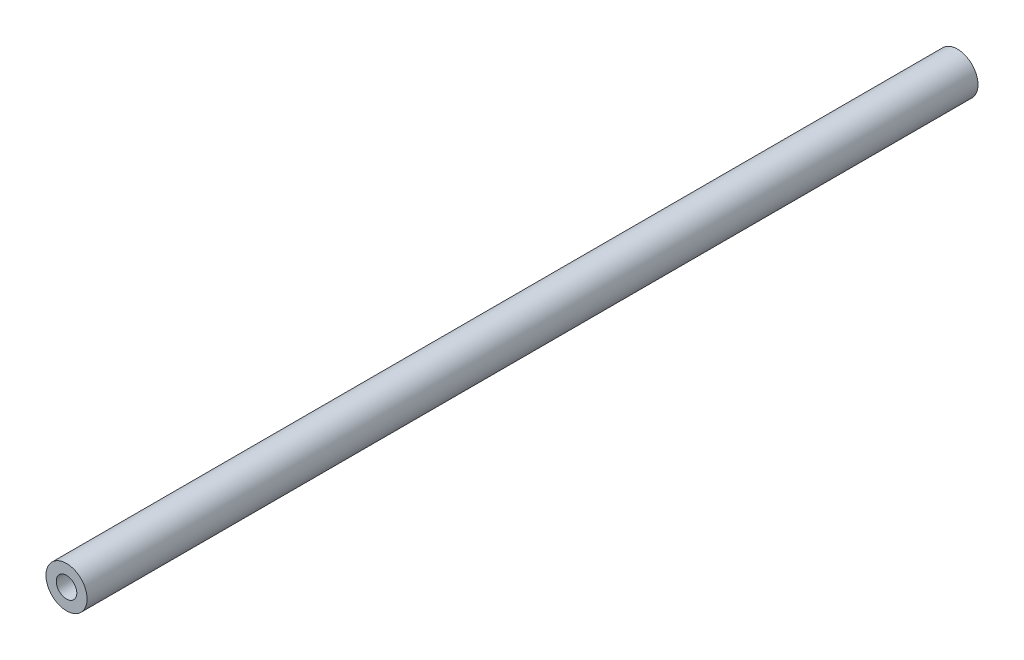
ISO-10303-21;
HEADER;
FILE_DESCRIPTION(('STEP AP214'),'2;1');
FILE_NAME('part.step','',(''),(''),'','','');
FILE_SCHEMA(('AUTOMOTIVE_DESIGN { 1 0 10303 214 1 1 1 1 }'));
ENDSEC;
DATA;
#1=APPLICATION_CONTEXT('core data for automotive mechanical design processes');
#2=APPLICATION_PROTOCOL_DEFINITION('international standard','automotive_design',2000,#1);
#3=PRODUCT_CONTEXT('',#1,'mechanical');
#4=PRODUCT('Part','Part','',(#3));
#5=PRODUCT_RELATED_PRODUCT_CATEGORY('part','',(#4));
#6=PRODUCT_DEFINITION_FORMATION('','',#4);
#7=PRODUCT_DEFINITION_CONTEXT('part definition',#1,'design');
#8=PRODUCT_DEFINITION('design','',#6,#7);
#9=PRODUCT_DEFINITION_SHAPE('','',#8);
#10=(LENGTH_UNIT() NAMED_UNIT(*) SI_UNIT(.MILLI.,.METRE.));
#11=(NAMED_UNIT(*) PLANE_ANGLE_UNIT() SI_UNIT($,.RADIAN.));
#12=(NAMED_UNIT(*) SI_UNIT($,.STERADIAN.) SOLID_ANGLE_UNIT());
#13=UNCERTAINTY_MEASURE_WITH_UNIT(LENGTH_MEASURE(1.E-05),#10,'distance_accuracy_value','');
#14=(GEOMETRIC_REPRESENTATION_CONTEXT(3) GLOBAL_UNCERTAINTY_ASSIGNED_CONTEXT((#13)) GLOBAL_UNIT_ASSIGNED_CONTEXT((#10,
#11,#12)) REPRESENTATION_CONTEXT('',''));
#15=CARTESIAN_POINT('',(0.,0.,0.));
#16=DIRECTION('',(0.,0.,1.));
#17=DIRECTION('',(1.,0.,0.));
#18=AXIS2_PLACEMENT_3D('',#15,#16,#17);
#19=CARTESIAN_POINT('',(0.,0.,130.));
#20=DIRECTION('',(0.,0.,1.));
#21=DIRECTION('',(1.,0.,0.));
#22=AXIS2_PLACEMENT_3D('',#19,#20,#21);
#23=PLANE('',#22);
#24=CARTESIAN_POINT('',(0.,0.,130.));
#25=DIRECTION('',(0.,0.,1.));
#26=DIRECTION('',(1.,0.,0.));
#27=AXIS2_PLACEMENT_3D('',#24,#25,#26);
#28=CIRCLE('',#27,3.);
#29=CARTESIAN_POINT('',(3.,0.,130.));
#30=VERTEX_POINT('',#29);
#31=EDGE_CURVE('E10',#30,#30,#28,.T.);
#32=ORIENTED_EDGE('',*,*,#31,.T.);
#33=EDGE_LOOP('',(#32));
#34=FACE_BOUND('',#33,.T.);
#35=CARTESIAN_POINT('',(0.,0.,130.));
#36=DIRECTION('',(0.,0.,1.));
#37=DIRECTION('',(1.,0.,0.));
#38=AXIS2_PLACEMENT_3D('',#35,#36,#37);
#39=CIRCLE('',#38,1.5);
#40=CARTESIAN_POINT('',(1.5,0.,130.));
#41=VERTEX_POINT('',#40);
#42=EDGE_CURVE('E43',#41,#41,#39,.T.);
#43=ORIENTED_EDGE('',*,*,#42,.F.);
#44=EDGE_LOOP('',(#43));
#45=FACE_BOUND('',#44,.T.);
#46=ADVANCED_FACE('F32',(#34,#45),#23,.T.);
#47=CARTESIAN_POINT('',(0.,0.,0.));
#48=DIRECTION('',(0.,0.,1.));
#49=DIRECTION('',(1.,0.,0.));
#50=AXIS2_PLACEMENT_3D('',#47,#48,#49);
#51=PLANE('',#50);
#52=CARTESIAN_POINT('',(0.,0.,0.));
#53=DIRECTION('',(0.,0.,1.));
#54=DIRECTION('',(1.,0.,0.));
#55=AXIS2_PLACEMENT_3D('',#52,#53,#54);
#56=CIRCLE('',#55,3.);
#57=CARTESIAN_POINT('',(3.,0.,0.));
#58=VERTEX_POINT('',#57);
#59=EDGE_CURVE('E36',#58,#58,#56,.T.);
#60=ORIENTED_EDGE('',*,*,#59,.F.);
#61=EDGE_LOOP('',(#60));
#62=FACE_BOUND('',#61,.T.);
#63=CARTESIAN_POINT('',(0.,0.,0.));
#64=DIRECTION('',(0.,0.,1.));
#65=DIRECTION('',(1.,0.,0.));
#66=AXIS2_PLACEMENT_3D('',#63,#64,#65);
#67=CIRCLE('',#66,1.5);
#68=CARTESIAN_POINT('',(1.5,0.,0.));
#69=VERTEX_POINT('',#68);
#70=EDGE_CURVE('E45',#69,#69,#67,.T.);
#71=ORIENTED_EDGE('',*,*,#70,.T.);
#72=EDGE_LOOP('',(#71));
#73=FACE_BOUND('',#72,.T.);
#74=ADVANCED_FACE('F55',(#62,#73),#51,.F.);
#75=CARTESIAN_POINT('',(0.,0.,130.));
#76=DIRECTION('',(0.,0.,-1.));
#77=DIRECTION('',(-1.,0.,0.));
#78=AXIS2_PLACEMENT_3D('',#75,#76,#77);
#79=CYLINDRICAL_SURFACE('',#78,3.);
#80=ORIENTED_EDGE('',*,*,#31,.F.);
#81=EDGE_LOOP('',(#80));
#82=FACE_BOUND('',#81,.T.);
#83=ORIENTED_EDGE('',*,*,#59,.T.);
#84=EDGE_LOOP('',(#83));
#85=FACE_BOUND('',#84,.T.);
#86=ADVANCED_FACE('F34',(#82,#85),#79,.T.);
#87=CARTESIAN_POINT('',(0.,0.,130.));
#88=DIRECTION('',(0.,0.,-1.));
#89=DIRECTION('',(-1.,0.,0.));
#90=AXIS2_PLACEMENT_3D('',#87,#88,#89);
#91=CYLINDRICAL_SURFACE('',#90,1.5);
#92=ORIENTED_EDGE('',*,*,#42,.T.);
#93=EDGE_LOOP('',(#92));
#94=FACE_BOUND('',#93,.T.);
#95=ORIENTED_EDGE('',*,*,#70,.F.);
#96=EDGE_LOOP('',(#95));
#97=FACE_BOUND('',#96,.T.);
#98=ADVANCED_FACE('F51',(#94,#97),#91,.F.);
#99=CLOSED_SHELL('',(#46,#74,#86,#98));
#100=MANIFOLD_SOLID_BREP('B2',#99);
#101=ADVANCED_BREP_SHAPE_REPRESENTATION('',(#18,#100),#14);
#102=SHAPE_DEFINITION_REPRESENTATION(#9,#101);
ENDSEC;
END-ISO-10303-21;
